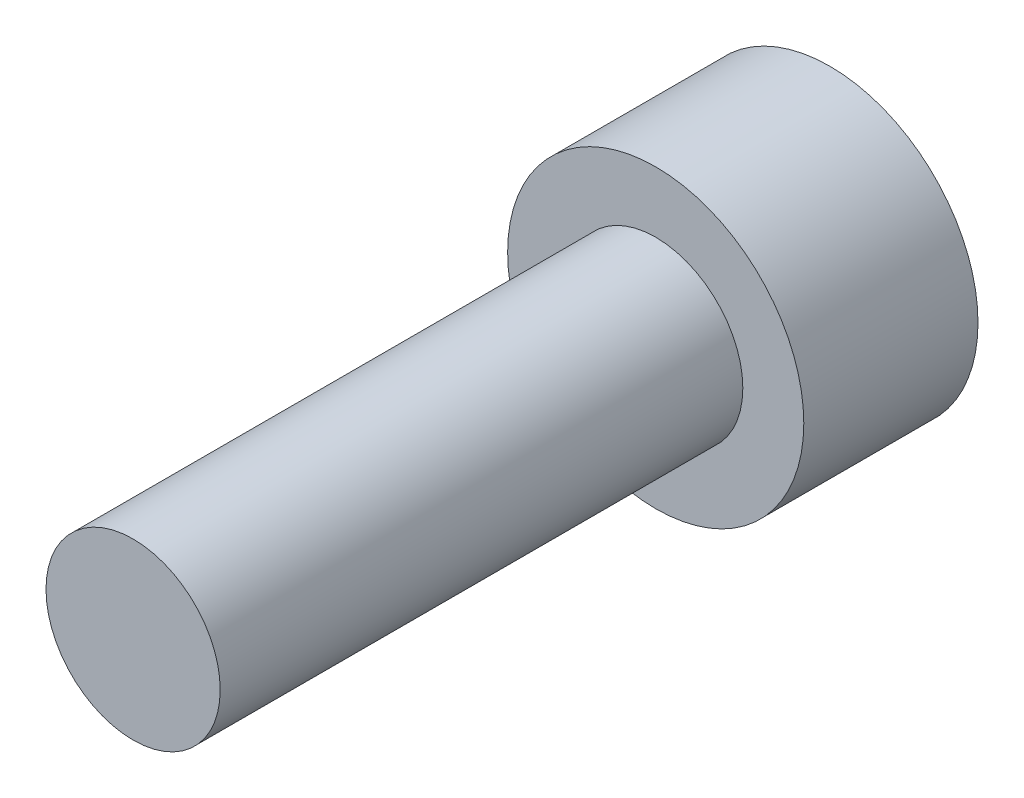
ISO-10303-21;
HEADER;
FILE_DESCRIPTION(('STEP AP214'),'2;1');
FILE_NAME('part.step','',(''),(''),'','','');
FILE_SCHEMA(('AUTOMOTIVE_DESIGN { 1 0 10303 214 1 1 1 1 }'));
ENDSEC;
DATA;
#1=APPLICATION_CONTEXT('core data for automotive mechanical design processes');
#2=APPLICATION_PROTOCOL_DEFINITION('international standard','automotive_design',2000,#1);
#3=PRODUCT_CONTEXT('',#1,'mechanical');
#4=PRODUCT('Part','Part','',(#3));
#5=PRODUCT_RELATED_PRODUCT_CATEGORY('part','',(#4));
#6=PRODUCT_DEFINITION_FORMATION('','',#4);
#7=PRODUCT_DEFINITION_CONTEXT('part definition',#1,'design');
#8=PRODUCT_DEFINITION('design','',#6,#7);
#9=PRODUCT_DEFINITION_SHAPE('','',#8);
#10=(LENGTH_UNIT() NAMED_UNIT(*) SI_UNIT(.MILLI.,.METRE.));
#11=(NAMED_UNIT(*) PLANE_ANGLE_UNIT() SI_UNIT($,.RADIAN.));
#12=(NAMED_UNIT(*) SI_UNIT($,.STERADIAN.) SOLID_ANGLE_UNIT());
#13=UNCERTAINTY_MEASURE_WITH_UNIT(LENGTH_MEASURE(1.E-05),#10,'distance_accuracy_value','');
#14=(GEOMETRIC_REPRESENTATION_CONTEXT(3) GLOBAL_UNCERTAINTY_ASSIGNED_CONTEXT((#13)) GLOBAL_UNIT_ASSIGNED_CONTEXT((#10,
#11,#12)) REPRESENTATION_CONTEXT('',''));
#15=CARTESIAN_POINT('',(0.,0.,0.));
#16=DIRECTION('',(0.,0.,1.));
#17=DIRECTION('',(1.,0.,0.));
#18=AXIS2_PLACEMENT_3D('',#15,#16,#17);
#19=CARTESIAN_POINT('',(0.,0.,5.));
#20=DIRECTION('',(0.,0.,1.));
#21=DIRECTION('',(1.,0.,0.));
#22=AXIS2_PLACEMENT_3D('',#19,#20,#21);
#23=PLANE('',#22);
#24=CARTESIAN_POINT('',(0.,0.,5.));
#25=DIRECTION('',(0.,0.,1.));
#26=DIRECTION('',(1.,0.,0.));
#27=AXIS2_PLACEMENT_3D('',#24,#25,#26);
#28=CIRCLE('',#27,4.25);
#29=CARTESIAN_POINT('',(4.25,0.,5.));
#30=VERTEX_POINT('',#29);
#31=EDGE_CURVE('E11',#30,#30,#28,.T.);
#32=ORIENTED_EDGE('',*,*,#31,.T.);
#33=EDGE_LOOP('',(#32));
#34=FACE_BOUND('',#33,.T.);
#35=CARTESIAN_POINT('',(0.,0.,5.));
#36=DIRECTION('',(0.,0.,1.));
#37=DIRECTION('',(1.,0.,0.));
#38=AXIS2_PLACEMENT_3D('',#35,#36,#37);
#39=CIRCLE('',#38,2.5);
#40=CARTESIAN_POINT('',(2.5,0.,5.));
#41=VERTEX_POINT('',#40);
#42=EDGE_CURVE('E139',#41,#41,#39,.T.);
#43=ORIENTED_EDGE('',*,*,#42,.F.);
#44=EDGE_LOOP('',(#43));
#45=FACE_BOUND('',#44,.T.);
#46=ADVANCED_FACE('F37',(#34,#45),#23,.T.);
#47=CARTESIAN_POINT('',(0.,0.,5.));
#48=DIRECTION('',(0.,0.,-1.));
#49=DIRECTION('',(-1.,0.,0.));
#50=AXIS2_PLACEMENT_3D('',#47,#48,#49);
#51=CYLINDRICAL_SURFACE('',#50,4.25);
#52=ORIENTED_EDGE('',*,*,#31,.F.);
#53=EDGE_LOOP('',(#52));
#54=FACE_BOUND('',#53,.T.);
#55=CARTESIAN_POINT('',(0.,0.,0.));
#56=DIRECTION('',(0.,0.,1.));
#57=DIRECTION('',(1.,0.,0.));
#58=AXIS2_PLACEMENT_3D('',#55,#56,#57);
#59=CIRCLE('',#58,4.25);
#60=CARTESIAN_POINT('',(4.25,0.,0.));
#61=VERTEX_POINT('',#60);
#62=EDGE_CURVE('E41',#61,#61,#59,.T.);
#63=ORIENTED_EDGE('',*,*,#62,.T.);
#64=EDGE_LOOP('',(#63));
#65=FACE_BOUND('',#64,.T.);
#66=ADVANCED_FACE('F39',(#54,#65),#51,.T.);
#67=CARTESIAN_POINT('',(0.,0.,0.));
#68=DIRECTION('',(0.,0.,1.));
#69=DIRECTION('',(1.,0.,0.));
#70=AXIS2_PLACEMENT_3D('',#67,#68,#69);
#71=PLANE('',#70);
#72=DIRECTION('',(0.102449727883256,0.994738183270677,0.));
#73=VECTOR('',#72,1.);
#74=CARTESIAN_POINT('',(-2.48124722621836,-1.11094189257384,0.));
#75=LINE('',#74,#73);
#76=CARTESIAN_POINT('',(-2.48124722621836,-1.11094189257384,0.));
#77=VERTEX_POINT('',#76);
#78=CARTESIAN_POINT('',(-2.20272751420649,1.59335218468785,0.));
#79=VERTEX_POINT('',#78);
#80=EDGE_CURVE('E126',#77,#79,#75,.T.);
#81=ORIENTED_EDGE('',*,*,#80,.F.);
#82=DIRECTION('',(-0.810243672885159,0.586093158593041,0.));
#83=VECTOR('',#82,1.);
#84=CARTESIAN_POINT('',(-0.278519712011871,-2.70429407726169,0.));
#85=LINE('',#84,#83);
#86=CARTESIAN_POINT('',(-0.278519712011871,-2.70429407726169,0.));
#87=VERTEX_POINT('',#86);
#88=EDGE_CURVE('E52',#87,#77,#85,.T.);
#89=ORIENTED_EDGE('',*,*,#88,.F.);
#90=DIRECTION('',(-0.912693400768415,-0.408645024677636,0.));
#91=VECTOR('',#90,1.);
#92=CARTESIAN_POINT('',(2.20272751420649,-1.59335218468785,0.));
#93=LINE('',#92,#91);
#94=CARTESIAN_POINT('',(2.20272751420649,-1.59335218468785,0.));
#95=VERTEX_POINT('',#94);
#96=EDGE_CURVE('E135',#95,#87,#93,.T.);
#97=ORIENTED_EDGE('',*,*,#96,.F.);
#98=DIRECTION('',(-0.102449727883256,-0.994738183270677,0.));
#99=VECTOR('',#98,1.);
#100=CARTESIAN_POINT('',(2.48124722621836,1.11094189257384,0.));
#101=LINE('',#100,#99);
#102=CARTESIAN_POINT('',(2.48124722621836,1.11094189257384,0.));
#103=VERTEX_POINT('',#102);
#104=EDGE_CURVE('E133',#103,#95,#101,.T.);
#105=ORIENTED_EDGE('',*,*,#104,.F.);
#106=DIRECTION('',(0.810243672885159,-0.586093158593041,0.));
#107=VECTOR('',#106,1.);
#108=CARTESIAN_POINT('',(0.278519712011872,2.70429407726169,0.));
#109=LINE('',#108,#107);
#110=CARTESIAN_POINT('',(0.278519712011872,2.70429407726169,0.));
#111=VERTEX_POINT('',#110);
#112=EDGE_CURVE('E100',#111,#103,#109,.T.);
#113=ORIENTED_EDGE('',*,*,#112,.F.);
#114=DIRECTION('',(0.912693400768415,0.408645024677636,0.));
#115=VECTOR('',#114,1.);
#116=CARTESIAN_POINT('',(-2.20272751420649,1.59335218468785,0.));
#117=LINE('',#116,#115);
#118=EDGE_CURVE('E129',#79,#111,#117,.T.);
#119=ORIENTED_EDGE('',*,*,#118,.F.);
#120=EDGE_LOOP('',(#81,#89,#97,#105,#113,#119));
#121=FACE_BOUND('',#120,.T.);
#122=ORIENTED_EDGE('',*,*,#62,.F.);
#123=EDGE_LOOP('',(#122));
#124=FACE_BOUND('',#123,.T.);
#125=ADVANCED_FACE('F159',(#121,#124),#71,.F.);
#126=CARTESIAN_POINT('',(0.,0.,20.));
#127=DIRECTION('',(0.,0.,-1.));
#128=DIRECTION('',(-1.,0.,0.));
#129=AXIS2_PLACEMENT_3D('',#126,#127,#128);
#130=CYLINDRICAL_SURFACE('',#129,2.5);
#131=CARTESIAN_POINT('',(0.,0.,20.));
#132=DIRECTION('',(0.,0.,1.));
#133=DIRECTION('',(1.,0.,0.));
#134=AXIS2_PLACEMENT_3D('',#131,#132,#133);
#135=CIRCLE('',#134,2.5);
#136=CARTESIAN_POINT('',(2.5,0.,20.));
#137=VERTEX_POINT('',#136);
#138=EDGE_CURVE('E145',#137,#137,#135,.T.);
#139=ORIENTED_EDGE('',*,*,#138,.F.);
#140=EDGE_LOOP('',(#139));
#141=FACE_BOUND('',#140,.T.);
#142=ORIENTED_EDGE('',*,*,#42,.T.);
#143=EDGE_LOOP('',(#142));
#144=FACE_BOUND('',#143,.T.);
#145=ADVANCED_FACE('F151',(#141,#144),#130,.T.);
#146=CARTESIAN_POINT('',(0.,0.,20.));
#147=DIRECTION('',(0.,0.,1.));
#148=DIRECTION('',(1.,0.,0.));
#149=AXIS2_PLACEMENT_3D('',#146,#147,#148);
#150=PLANE('',#149);
#151=ORIENTED_EDGE('',*,*,#138,.T.);
#152=EDGE_LOOP('',(#151));
#153=FACE_BOUND('',#152,.T.);
#154=ADVANCED_FACE('F168',(#153),#150,.T.);
#155=CARTESIAN_POINT('',(-0.278519712011871,-2.70429407726169,2.));
#156=DIRECTION('',(-0.586093158593041,-0.810243672885159,0.));
#157=DIRECTION('',(0.810243672885159,-0.586093158593041,0.));
#158=AXIS2_PLACEMENT_3D('',#155,#156,#157);
#159=PLANE('',#158);
#160=ORIENTED_EDGE('',*,*,#88,.T.);
#161=DIRECTION('',(0.,0.,-1.));
#162=VECTOR('',#161,1.);
#163=CARTESIAN_POINT('',(-2.48124722621836,-1.11094189257384,2.));
#164=LINE('',#163,#162);
#165=CARTESIAN_POINT('',(-2.48124722621836,-1.11094189257384,2.));
#166=VERTEX_POINT('',#165);
#167=EDGE_CURVE('E82',#166,#77,#164,.T.);
#168=ORIENTED_EDGE('',*,*,#167,.F.);
#169=DIRECTION('',(-0.810243672885159,0.586093158593041,0.));
#170=VECTOR('',#169,1.);
#171=CARTESIAN_POINT('',(-0.278519712011871,-2.70429407726169,2.));
#172=LINE('',#171,#170);
#173=CARTESIAN_POINT('',(-0.278519712011871,-2.70429407726169,2.));
#174=VERTEX_POINT('',#173);
#175=EDGE_CURVE('E137',#174,#166,#172,.T.);
#176=ORIENTED_EDGE('',*,*,#175,.F.);
#177=DIRECTION('',(0.,0.,-1.));
#178=VECTOR('',#177,1.);
#179=CARTESIAN_POINT('',(-0.278519712011871,-2.70429407726169,2.));
#180=LINE('',#179,#178);
#181=EDGE_CURVE('E60',#174,#87,#180,.T.);
#182=ORIENTED_EDGE('',*,*,#181,.T.);
#183=EDGE_LOOP('',(#160,#168,#176,#182));
#184=FACE_BOUND('',#183,.T.);
#185=ADVANCED_FACE('F180',(#184),#159,.F.);
#186=CARTESIAN_POINT('',(2.20272751420649,-1.59335218468785,2.));
#187=DIRECTION('',(0.408645024677636,-0.912693400768415,0.));
#188=DIRECTION('',(0.912693400768415,0.408645024677636,0.));
#189=AXIS2_PLACEMENT_3D('',#186,#187,#188);
#190=PLANE('',#189);
#191=ORIENTED_EDGE('',*,*,#96,.T.);
#192=ORIENTED_EDGE('',*,*,#181,.F.);
#193=DIRECTION('',(-0.912693400768415,-0.408645024677636,0.));
#194=VECTOR('',#193,1.);
#195=CARTESIAN_POINT('',(2.20272751420649,-1.59335218468785,2.));
#196=LINE('',#195,#194);
#197=CARTESIAN_POINT('',(2.20272751420649,-1.59335218468785,2.));
#198=VERTEX_POINT('',#197);
#199=EDGE_CURVE('E112',#198,#174,#196,.T.);
#200=ORIENTED_EDGE('',*,*,#199,.F.);
#201=DIRECTION('',(0.,0.,-1.));
#202=VECTOR('',#201,1.);
#203=CARTESIAN_POINT('',(2.20272751420649,-1.59335218468785,2.));
#204=LINE('',#203,#202);
#205=EDGE_CURVE('E104',#198,#95,#204,.T.);
#206=ORIENTED_EDGE('',*,*,#205,.T.);
#207=EDGE_LOOP('',(#191,#192,#200,#206));
#208=FACE_BOUND('',#207,.T.);
#209=ADVANCED_FACE('F182',(#208),#190,.F.);
#210=CARTESIAN_POINT('',(2.48124722621836,1.11094189257384,2.));
#211=DIRECTION('',(0.994738183270677,-0.102449727883256,0.));
#212=DIRECTION('',(0.102449727883256,0.994738183270677,0.));
#213=AXIS2_PLACEMENT_3D('',#210,#211,#212);
#214=PLANE('',#213);
#215=ORIENTED_EDGE('',*,*,#104,.T.);
#216=ORIENTED_EDGE('',*,*,#205,.F.);
#217=DIRECTION('',(-0.102449727883256,-0.994738183270677,0.));
#218=VECTOR('',#217,1.);
#219=CARTESIAN_POINT('',(2.48124722621836,1.11094189257384,2.));
#220=LINE('',#219,#218);
#221=CARTESIAN_POINT('',(2.48124722621836,1.11094189257384,2.));
#222=VERTEX_POINT('',#221);
#223=EDGE_CURVE('E108',#222,#198,#220,.T.);
#224=ORIENTED_EDGE('',*,*,#223,.F.);
#225=DIRECTION('',(0.,0.,-1.));
#226=VECTOR('',#225,1.);
#227=CARTESIAN_POINT('',(2.48124722621836,1.11094189257384,2.));
#228=LINE('',#227,#226);
#229=EDGE_CURVE('E93',#222,#103,#228,.T.);
#230=ORIENTED_EDGE('',*,*,#229,.T.);
#231=EDGE_LOOP('',(#215,#216,#224,#230));
#232=FACE_BOUND('',#231,.T.);
#233=ADVANCED_FACE('F109',(#232),#214,.F.);
#234=CARTESIAN_POINT('',(0.278519712011872,2.70429407726169,2.));
#235=DIRECTION('',(0.586093158593041,0.810243672885159,0.));
#236=DIRECTION('',(-0.810243672885159,0.586093158593041,0.));
#237=AXIS2_PLACEMENT_3D('',#234,#235,#236);
#238=PLANE('',#237);
#239=ORIENTED_EDGE('',*,*,#112,.T.);
#240=ORIENTED_EDGE('',*,*,#229,.F.);
#241=DIRECTION('',(0.810243672885159,-0.586093158593041,0.));
#242=VECTOR('',#241,1.);
#243=CARTESIAN_POINT('',(0.278519712011872,2.70429407726169,2.));
#244=LINE('',#243,#242);
#245=CARTESIAN_POINT('',(0.278519712011872,2.70429407726169,2.));
#246=VERTEX_POINT('',#245);
#247=EDGE_CURVE('E97',#246,#222,#244,.T.);
#248=ORIENTED_EDGE('',*,*,#247,.F.);
#249=DIRECTION('',(0.,0.,-1.));
#250=VECTOR('',#249,1.);
#251=CARTESIAN_POINT('',(0.278519712011872,2.70429407726169,2.));
#252=LINE('',#251,#250);
#253=EDGE_CURVE('E105',#246,#111,#252,.T.);
#254=ORIENTED_EDGE('',*,*,#253,.T.);
#255=EDGE_LOOP('',(#239,#240,#248,#254));
#256=FACE_BOUND('',#255,.T.);
#257=ADVANCED_FACE('F95',(#256),#238,.F.);
#258=CARTESIAN_POINT('',(-2.20272751420649,1.59335218468785,2.));
#259=DIRECTION('',(-0.408645024677636,0.912693400768415,0.));
#260=DIRECTION('',(-0.912693400768415,-0.408645024677636,0.));
#261=AXIS2_PLACEMENT_3D('',#258,#259,#260);
#262=PLANE('',#261);
#263=ORIENTED_EDGE('',*,*,#118,.T.);
#264=ORIENTED_EDGE('',*,*,#253,.F.);
#265=DIRECTION('',(0.912693400768415,0.408645024677636,0.));
#266=VECTOR('',#265,1.);
#267=CARTESIAN_POINT('',(-2.20272751420649,1.59335218468785,2.));
#268=LINE('',#267,#266);
#269=CARTESIAN_POINT('',(-2.20272751420649,1.59335218468785,2.));
#270=VERTEX_POINT('',#269);
#271=EDGE_CURVE('E118',#270,#246,#268,.T.);
#272=ORIENTED_EDGE('',*,*,#271,.F.);
#273=DIRECTION('',(0.,0.,-1.));
#274=VECTOR('',#273,1.);
#275=CARTESIAN_POINT('',(-2.20272751420649,1.59335218468785,2.));
#276=LINE('',#275,#274);
#277=EDGE_CURVE('E142',#270,#79,#276,.T.);
#278=ORIENTED_EDGE('',*,*,#277,.T.);
#279=EDGE_LOOP('',(#263,#264,#272,#278));
#280=FACE_BOUND('',#279,.T.);
#281=ADVANCED_FACE('F193',(#280),#262,.F.);
#282=CARTESIAN_POINT('',(-2.48124722621836,-1.11094189257384,2.));
#283=DIRECTION('',(-0.994738183270677,0.102449727883256,0.));
#284=DIRECTION('',(-0.102449727883256,-0.994738183270677,0.));
#285=AXIS2_PLACEMENT_3D('',#282,#283,#284);
#286=PLANE('',#285);
#287=ORIENTED_EDGE('',*,*,#80,.T.);
#288=ORIENTED_EDGE('',*,*,#277,.F.);
#289=DIRECTION('',(0.102449727883256,0.994738183270677,0.));
#290=VECTOR('',#289,1.);
#291=CARTESIAN_POINT('',(-2.48124722621836,-1.11094189257384,2.));
#292=LINE('',#291,#290);
#293=EDGE_CURVE('E120',#166,#270,#292,.T.);
#294=ORIENTED_EDGE('',*,*,#293,.F.);
#295=ORIENTED_EDGE('',*,*,#167,.T.);
#296=EDGE_LOOP('',(#287,#288,#294,#295));
#297=FACE_BOUND('',#296,.T.);
#298=ADVANCED_FACE('F178',(#297),#286,.F.);
#299=CARTESIAN_POINT('',(0.,0.,2.));
#300=DIRECTION('',(0.,0.,-1.));
#301=DIRECTION('',(-1.,0.,0.));
#302=AXIS2_PLACEMENT_3D('',#299,#300,#301);
#303=PLANE('',#302);
#304=ORIENTED_EDGE('',*,*,#175,.T.);
#305=ORIENTED_EDGE('',*,*,#293,.T.);
#306=ORIENTED_EDGE('',*,*,#271,.T.);
#307=ORIENTED_EDGE('',*,*,#247,.T.);
#308=ORIENTED_EDGE('',*,*,#223,.T.);
#309=ORIENTED_EDGE('',*,*,#199,.T.);
#310=EDGE_LOOP('',(#304,#305,#306,#307,#308,#309));
#311=FACE_BOUND('',#310,.T.);
#312=ADVANCED_FACE('F115',(#311),#303,.T.);
#313=CLOSED_SHELL('',(#46,#66,#125,#145,#154,#185,#209,#233,#257,#281,#298,#312));
#314=MANIFOLD_SOLID_BREP('B2',#313);
#315=ADVANCED_BREP_SHAPE_REPRESENTATION('',(#18,#314),#14);
#316=SHAPE_DEFINITION_REPRESENTATION(#9,#315);
ENDSEC;
END-ISO-10303-21;
